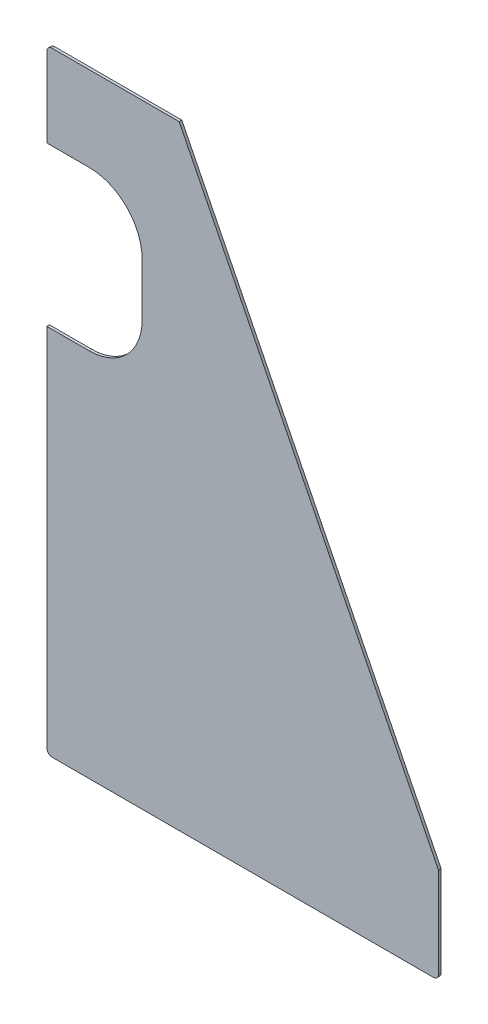
ISO-10303-21;
HEADER;
FILE_DESCRIPTION(('STEP AP214'),'2;1');
FILE_NAME('part.step','',(''),(''),'','','');
FILE_SCHEMA(('AUTOMOTIVE_DESIGN { 1 0 10303 214 1 1 1 1 }'));
ENDSEC;
DATA;
#1=APPLICATION_CONTEXT('core data for automotive mechanical design processes');
#2=APPLICATION_PROTOCOL_DEFINITION('international standard','automotive_design',2000,#1);
#3=PRODUCT_CONTEXT('',#1,'mechanical');
#4=PRODUCT('Part','Part','',(#3));
#5=PRODUCT_RELATED_PRODUCT_CATEGORY('part','',(#4));
#6=PRODUCT_DEFINITION_FORMATION('','',#4);
#7=PRODUCT_DEFINITION_CONTEXT('part definition',#1,'design');
#8=PRODUCT_DEFINITION('design','',#6,#7);
#9=PRODUCT_DEFINITION_SHAPE('','',#8);
#10=(LENGTH_UNIT() NAMED_UNIT(*) SI_UNIT(.MILLI.,.METRE.));
#11=(NAMED_UNIT(*) PLANE_ANGLE_UNIT() SI_UNIT($,.RADIAN.));
#12=(NAMED_UNIT(*) SI_UNIT($,.STERADIAN.) SOLID_ANGLE_UNIT());
#13=UNCERTAINTY_MEASURE_WITH_UNIT(LENGTH_MEASURE(1.E-05),#10,'distance_accuracy_value','');
#14=(GEOMETRIC_REPRESENTATION_CONTEXT(3) GLOBAL_UNCERTAINTY_ASSIGNED_CONTEXT((#13)) GLOBAL_UNIT_ASSIGNED_CONTEXT((#10,
#11,#12)) REPRESENTATION_CONTEXT('',''));
#15=CARTESIAN_POINT('',(0.,0.,0.));
#16=DIRECTION('',(0.,0.,1.));
#17=DIRECTION('',(1.,0.,0.));
#18=AXIS2_PLACEMENT_3D('',#15,#16,#17);
#19=CARTESIAN_POINT('',(-370.,-580.,5.));
#20=DIRECTION('',(1.,0.,0.));
#21=DIRECTION('',(0.,0.,-1.));
#22=AXIS2_PLACEMENT_3D('',#19,#20,#21);
#23=PLANE('',#22);
#24=DIRECTION('',(0.,-1.,0.));
#25=VECTOR('',#24,1.);
#26=CARTESIAN_POINT('',(-370.,-580.,5.));
#27=LINE('',#26,#25);
#28=CARTESIAN_POINT('',(-370.,120.,5.));
#29=VERTEX_POINT('',#28);
#30=CARTESIAN_POINT('',(-370.,-570.,5.));
#31=VERTEX_POINT('',#30);
#32=EDGE_CURVE('E160',#29,#31,#27,.T.);
#33=ORIENTED_EDGE('',*,*,#32,.F.);
#34=DIRECTION('',(0.,0.,-1.));
#35=VECTOR('',#34,1.);
#36=CARTESIAN_POINT('',(-370.,120.,5.));
#37=LINE('',#36,#35);
#38=CARTESIAN_POINT('',(-370.,120.,0.));
#39=VERTEX_POINT('',#38);
#40=EDGE_CURVE('E152',#29,#39,#37,.T.);
#41=ORIENTED_EDGE('',*,*,#40,.T.);
#42=DIRECTION('',(0.,-1.,0.));
#43=VECTOR('',#42,1.);
#44=CARTESIAN_POINT('',(-370.,-580.,0.));
#45=LINE('',#44,#43);
#46=CARTESIAN_POINT('',(-370.,-570.,0.));
#47=VERTEX_POINT('',#46);
#48=EDGE_CURVE('E175',#39,#47,#45,.T.);
#49=ORIENTED_EDGE('',*,*,#48,.T.);
#50=DIRECTION('',(0.,0.,-1.));
#51=VECTOR('',#50,1.);
#52=CARTESIAN_POINT('',(-370.,-570.,5.));
#53=LINE('',#52,#51);
#54=EDGE_CURVE('E195',#47,#31,#53,.F.);
#55=ORIENTED_EDGE('',*,*,#54,.T.);
#56=EDGE_LOOP('',(#33,#41,#49,#55));
#57=FACE_BOUND('',#56,.T.);
#58=ADVANCED_FACE('F33',(#57),#23,.F.);
#59=CARTESIAN_POINT('',(370.,-580.,5.));
#60=DIRECTION('',(-1.,0.,0.));
#61=DIRECTION('',(0.,0.,1.));
#62=AXIS2_PLACEMENT_3D('',#59,#60,#61);
#63=PLANE('',#62);
#64=DIRECTION('',(0.,1.,0.));
#65=VECTOR('',#64,1.);
#66=CARTESIAN_POINT('',(370.,-580.,0.));
#67=LINE('',#66,#65);
#68=CARTESIAN_POINT('',(370.,-570.,0.));
#69=VERTEX_POINT('',#68);
#70=CARTESIAN_POINT('',(370.,-400.,0.));
#71=VERTEX_POINT('',#70);
#72=EDGE_CURVE('E169',#69,#71,#67,.T.);
#73=ORIENTED_EDGE('',*,*,#72,.T.);
#74=DIRECTION('',(0.,0.,-1.));
#75=VECTOR('',#74,1.);
#76=CARTESIAN_POINT('',(370.,-400.,5.));
#77=LINE('',#76,#75);
#78=CARTESIAN_POINT('',(370.,-400.,5.));
#79=VERTEX_POINT('',#78);
#80=EDGE_CURVE('E293',#79,#71,#77,.T.);
#81=ORIENTED_EDGE('',*,*,#80,.F.);
#82=DIRECTION('',(0.,1.,0.));
#83=VECTOR('',#82,1.);
#84=CARTESIAN_POINT('',(370.,-580.,5.));
#85=LINE('',#84,#83);
#86=CARTESIAN_POINT('',(370.,-570.,5.));
#87=VERTEX_POINT('',#86);
#88=EDGE_CURVE('E180',#87,#79,#85,.T.);
#89=ORIENTED_EDGE('',*,*,#88,.F.);
#90=DIRECTION('',(0.,0.,-1.));
#91=VECTOR('',#90,1.);
#92=CARTESIAN_POINT('',(370.,-570.,5.));
#93=LINE('',#92,#91);
#94=EDGE_CURVE('E203',#87,#69,#93,.T.);
#95=ORIENTED_EDGE('',*,*,#94,.T.);
#96=EDGE_LOOP('',(#73,#81,#89,#95));
#97=FACE_BOUND('',#96,.T.);
#98=ADVANCED_FACE('F235',(#97),#63,.F.);
#99=CARTESIAN_POINT('',(-370.,580.,5.));
#100=DIRECTION('',(0.,-1.,0.));
#101=DIRECTION('',(0.,0.,-1.));
#102=AXIS2_PLACEMENT_3D('',#99,#100,#101);
#103=PLANE('',#102);
#104=DIRECTION('',(-1.,0.,0.));
#105=VECTOR('',#104,1.);
#106=CARTESIAN_POINT('',(-370.,580.,5.));
#107=LINE('',#106,#105);
#108=CARTESIAN_POINT('',(-120.,580.,5.));
#109=VERTEX_POINT('',#108);
#110=CARTESIAN_POINT('',(-360.,580.,5.));
#111=VERTEX_POINT('',#110);
#112=EDGE_CURVE('E165',#109,#111,#107,.T.);
#113=ORIENTED_EDGE('',*,*,#112,.F.);
#114=DIRECTION('',(0.,0.,-1.));
#115=VECTOR('',#114,1.);
#116=CARTESIAN_POINT('',(-120.,580.,5.));
#117=LINE('',#116,#115);
#118=CARTESIAN_POINT('',(-120.,580.,0.));
#119=VERTEX_POINT('',#118);
#120=EDGE_CURVE('E173',#109,#119,#117,.T.);
#121=ORIENTED_EDGE('',*,*,#120,.T.);
#122=DIRECTION('',(-1.,0.,0.));
#123=VECTOR('',#122,1.);
#124=CARTESIAN_POINT('',(-370.,580.,0.));
#125=LINE('',#124,#123);
#126=CARTESIAN_POINT('',(-360.,580.,0.));
#127=VERTEX_POINT('',#126);
#128=EDGE_CURVE('E172',#119,#127,#125,.T.);
#129=ORIENTED_EDGE('',*,*,#128,.T.);
#130=DIRECTION('',(0.,0.,-1.));
#131=VECTOR('',#130,1.);
#132=CARTESIAN_POINT('',(-360.,580.,5.));
#133=LINE('',#132,#131);
#134=EDGE_CURVE('E206',#127,#111,#133,.F.);
#135=ORIENTED_EDGE('',*,*,#134,.T.);
#136=EDGE_LOOP('',(#113,#121,#129,#135));
#137=FACE_BOUND('',#136,.T.);
#138=ADVANCED_FACE('F241',(#137),#103,.F.);
#139=CARTESIAN_POINT('',(-370.,570.,0.));
#140=VERTEX_POINT('',#139);
#141=CARTESIAN_POINT('',(-370.,420.,0.));
#142=VERTEX_POINT('',#141);
#143=EDGE_CURVE('E151',#140,#142,#45,.T.);
#144=ORIENTED_EDGE('',*,*,#143,.T.);
#145=DIRECTION('',(0.,0.,1.));
#146=VECTOR('',#145,1.);
#147=CARTESIAN_POINT('',(-370.,420.,5.));
#148=LINE('',#147,#146);
#149=CARTESIAN_POINT('',(-370.,420.,5.));
#150=VERTEX_POINT('',#149);
#151=EDGE_CURVE('E136',#142,#150,#148,.T.);
#152=ORIENTED_EDGE('',*,*,#151,.T.);
#153=CARTESIAN_POINT('',(-370.,570.,5.));
#154=VERTEX_POINT('',#153);
#155=EDGE_CURVE('E148',#154,#150,#27,.T.);
#156=ORIENTED_EDGE('',*,*,#155,.F.);
#157=DIRECTION('',(0.,0.,-1.));
#158=VECTOR('',#157,1.);
#159=CARTESIAN_POINT('',(-370.,570.,5.));
#160=LINE('',#159,#158);
#161=EDGE_CURVE('E193',#154,#140,#160,.T.);
#162=ORIENTED_EDGE('',*,*,#161,.T.);
#163=EDGE_LOOP('',(#144,#152,#156,#162));
#164=FACE_BOUND('',#163,.T.);
#165=ADVANCED_FACE('F146',(#164),#23,.F.);
#166=CARTESIAN_POINT('',(-370.,-580.,5.));
#167=DIRECTION('',(0.,1.,0.));
#168=DIRECTION('',(0.,0.,1.));
#169=AXIS2_PLACEMENT_3D('',#166,#167,#168);
#170=PLANE('',#169);
#171=DIRECTION('',(1.,0.,0.));
#172=VECTOR('',#171,1.);
#173=CARTESIAN_POINT('',(-370.,-580.,5.));
#174=LINE('',#173,#172);
#175=CARTESIAN_POINT('',(-360.,-580.,5.));
#176=VERTEX_POINT('',#175);
#177=CARTESIAN_POINT('',(360.,-580.,5.));
#178=VERTEX_POINT('',#177);
#179=EDGE_CURVE('E159',#176,#178,#174,.T.);
#180=ORIENTED_EDGE('',*,*,#179,.F.);
#181=DIRECTION('',(0.,0.,-1.));
#182=VECTOR('',#181,1.);
#183=CARTESIAN_POINT('',(-360.,-580.,5.));
#184=LINE('',#183,#182);
#185=CARTESIAN_POINT('',(-360.,-580.,0.));
#186=VERTEX_POINT('',#185);
#187=EDGE_CURVE('E182',#176,#186,#184,.T.);
#188=ORIENTED_EDGE('',*,*,#187,.T.);
#189=DIRECTION('',(1.,0.,0.));
#190=VECTOR('',#189,1.);
#191=CARTESIAN_POINT('',(-370.,-580.,0.));
#192=LINE('',#191,#190);
#193=CARTESIAN_POINT('',(360.,-580.,0.));
#194=VERTEX_POINT('',#193);
#195=EDGE_CURVE('E177',#186,#194,#192,.T.);
#196=ORIENTED_EDGE('',*,*,#195,.T.);
#197=DIRECTION('',(0.,0.,-1.));
#198=VECTOR('',#197,1.);
#199=CARTESIAN_POINT('',(360.,-580.,5.));
#200=LINE('',#199,#198);
#201=EDGE_CURVE('E163',#194,#178,#200,.F.);
#202=ORIENTED_EDGE('',*,*,#201,.T.);
#203=EDGE_LOOP('',(#180,#188,#196,#202));
#204=FACE_BOUND('',#203,.T.);
#205=ADVANCED_FACE('F248',(#204),#170,.F.);
#206=CARTESIAN_POINT('',(0.,0.,5.));
#207=DIRECTION('',(0.,0.,-1.));
#208=DIRECTION('',(-1.,0.,0.));
#209=AXIS2_PLACEMENT_3D('',#206,#207,#208);
#210=PLANE('',#209);
#211=DIRECTION('',(0.,1.,0.));
#212=VECTOR('',#211,1.);
#213=CARTESIAN_POINT('',(-190.,120.,5.));
#214=LINE('',#213,#212);
#215=CARTESIAN_POINT('',(-190.,220.,5.));
#216=VERTEX_POINT('',#215);
#217=CARTESIAN_POINT('',(-190.,320.,5.));
#218=VERTEX_POINT('',#217);
#219=EDGE_CURVE('E142',#216,#218,#214,.T.);
#220=ORIENTED_EDGE('',*,*,#219,.F.);
#221=CARTESIAN_POINT('',(-290.,220.,5.));
#222=DIRECTION('',(0.,0.,-1.));
#223=DIRECTION('',(-1.,0.,0.));
#224=AXIS2_PLACEMENT_3D('',#221,#222,#223);
#225=CIRCLE('',#224,100.);
#226=CARTESIAN_POINT('',(-290.,120.,5.));
#227=VERTEX_POINT('',#226);
#228=EDGE_CURVE('E219',#216,#227,#225,.T.);
#229=ORIENTED_EDGE('',*,*,#228,.T.);
#230=DIRECTION('',(1.,0.,0.));
#231=VECTOR('',#230,1.);
#232=CARTESIAN_POINT('',(-550.,120.,5.));
#233=LINE('',#232,#231);
#234=EDGE_CURVE('E141',#29,#227,#233,.T.);
#235=ORIENTED_EDGE('',*,*,#234,.F.);
#236=ORIENTED_EDGE('',*,*,#32,.T.);
#237=CARTESIAN_POINT('',(-360.,-570.,5.));
#238=DIRECTION('',(0.,0.,-1.));
#239=DIRECTION('',(-1.,0.,0.));
#240=AXIS2_PLACEMENT_3D('',#237,#238,#239);
#241=CIRCLE('',#240,10.);
#242=EDGE_CURVE('E201',#31,#176,#241,.F.);
#243=ORIENTED_EDGE('',*,*,#242,.T.);
#244=ORIENTED_EDGE('',*,*,#179,.T.);
#245=CARTESIAN_POINT('',(360.,-570.,5.));
#246=DIRECTION('',(0.,0.,-1.));
#247=DIRECTION('',(-1.,0.,0.));
#248=AXIS2_PLACEMENT_3D('',#245,#246,#247);
#249=CIRCLE('',#248,10.);
#250=EDGE_CURVE('E199',#178,#87,#249,.F.);
#251=ORIENTED_EDGE('',*,*,#250,.T.);
#252=ORIENTED_EDGE('',*,*,#88,.T.);
#253=DIRECTION('',(-0.447213595499958,0.894427190999916,0.));
#254=VECTOR('',#253,1.);
#255=CARTESIAN_POINT('',(370.,-400.,5.));
#256=LINE('',#255,#254);
#257=EDGE_CURVE('E290',#79,#109,#256,.T.);
#258=ORIENTED_EDGE('',*,*,#257,.T.);
#259=ORIENTED_EDGE('',*,*,#112,.T.);
#260=CARTESIAN_POINT('',(-360.,570.,5.));
#261=DIRECTION('',(0.,0.,-1.));
#262=DIRECTION('',(-1.,0.,0.));
#263=AXIS2_PLACEMENT_3D('',#260,#261,#262);
#264=CIRCLE('',#263,10.);
#265=EDGE_CURVE('E158',#111,#154,#264,.F.);
#266=ORIENTED_EDGE('',*,*,#265,.T.);
#267=ORIENTED_EDGE('',*,*,#155,.T.);
#268=DIRECTION('',(-1.,0.,0.));
#269=VECTOR('',#268,1.);
#270=CARTESIAN_POINT('',(-550.,420.,5.));
#271=LINE('',#270,#269);
#272=CARTESIAN_POINT('',(-290.,420.,5.));
#273=VERTEX_POINT('',#272);
#274=EDGE_CURVE('E133',#273,#150,#271,.T.);
#275=ORIENTED_EDGE('',*,*,#274,.F.);
#276=CARTESIAN_POINT('',(-290.,320.,5.));
#277=DIRECTION('',(0.,0.,-1.));
#278=DIRECTION('',(-1.,0.,0.));
#279=AXIS2_PLACEMENT_3D('',#276,#277,#278);
#280=CIRCLE('',#279,100.);
#281=EDGE_CURVE('E41',#273,#218,#280,.T.);
#282=ORIENTED_EDGE('',*,*,#281,.T.);
#283=EDGE_LOOP('',(#220,#229,#235,#236,#243,#244,#251,#252,#258,#259,#266,#267,#275,#282));
#284=FACE_BOUND('',#283,.T.);
#285=ADVANCED_FACE('F156',(#284),#210,.F.);
#286=CARTESIAN_POINT('',(0.,0.,0.));
#287=DIRECTION('',(0.,0.,-1.));
#288=DIRECTION('',(-1.,0.,0.));
#289=AXIS2_PLACEMENT_3D('',#286,#287,#288);
#290=PLANE('',#289);
#291=DIRECTION('',(-1.,0.,0.));
#292=VECTOR('',#291,1.);
#293=CARTESIAN_POINT('',(0.,120.,0.));
#294=LINE('',#293,#292);
#295=CARTESIAN_POINT('',(-290.,120.,0.));
#296=VERTEX_POINT('',#295);
#297=EDGE_CURVE('E209',#296,#39,#294,.T.);
#298=ORIENTED_EDGE('',*,*,#297,.F.);
#299=CARTESIAN_POINT('',(-290.,220.,0.));
#300=DIRECTION('',(0.,0.,-1.));
#301=DIRECTION('',(-1.,0.,0.));
#302=AXIS2_PLACEMENT_3D('',#299,#300,#301);
#303=CIRCLE('',#302,100.);
#304=CARTESIAN_POINT('',(-190.,220.,0.));
#305=VERTEX_POINT('',#304);
#306=EDGE_CURVE('E221',#296,#305,#303,.F.);
#307=ORIENTED_EDGE('',*,*,#306,.T.);
#308=DIRECTION('',(0.,1.,0.));
#309=VECTOR('',#308,1.);
#310=CARTESIAN_POINT('',(-190.,120.,0.));
#311=LINE('',#310,#309);
#312=CARTESIAN_POINT('',(-190.,320.,0.));
#313=VERTEX_POINT('',#312);
#314=EDGE_CURVE('E281',#305,#313,#311,.T.);
#315=ORIENTED_EDGE('',*,*,#314,.T.);
#316=CARTESIAN_POINT('',(-290.,320.,0.));
#317=DIRECTION('',(0.,0.,-1.));
#318=DIRECTION('',(-1.,0.,0.));
#319=AXIS2_PLACEMENT_3D('',#316,#317,#318);
#320=CIRCLE('',#319,100.);
#321=CARTESIAN_POINT('',(-290.,420.,0.));
#322=VERTEX_POINT('',#321);
#323=EDGE_CURVE('E11',#313,#322,#320,.F.);
#324=ORIENTED_EDGE('',*,*,#323,.T.);
#325=DIRECTION('',(-1.,0.,0.));
#326=VECTOR('',#325,1.);
#327=CARTESIAN_POINT('',(-550.,420.,0.));
#328=LINE('',#327,#326);
#329=EDGE_CURVE('E153',#322,#142,#328,.T.);
#330=ORIENTED_EDGE('',*,*,#329,.T.);
#331=ORIENTED_EDGE('',*,*,#143,.F.);
#332=CARTESIAN_POINT('',(-360.,570.,0.));
#333=DIRECTION('',(0.,0.,-1.));
#334=DIRECTION('',(-1.,0.,0.));
#335=AXIS2_PLACEMENT_3D('',#332,#333,#334);
#336=CIRCLE('',#335,10.);
#337=EDGE_CURVE('E185',#140,#127,#336,.T.);
#338=ORIENTED_EDGE('',*,*,#337,.T.);
#339=ORIENTED_EDGE('',*,*,#128,.F.);
#340=DIRECTION('',(-0.447213595499958,0.894427190999916,0.));
#341=VECTOR('',#340,1.);
#342=CARTESIAN_POINT('',(370.,-400.,0.));
#343=LINE('',#342,#341);
#344=EDGE_CURVE('E289',#71,#119,#343,.T.);
#345=ORIENTED_EDGE('',*,*,#344,.F.);
#346=ORIENTED_EDGE('',*,*,#72,.F.);
#347=CARTESIAN_POINT('',(360.,-570.,0.));
#348=DIRECTION('',(0.,0.,-1.));
#349=DIRECTION('',(-1.,0.,0.));
#350=AXIS2_PLACEMENT_3D('',#347,#348,#349);
#351=CIRCLE('',#350,10.);
#352=EDGE_CURVE('E188',#69,#194,#351,.T.);
#353=ORIENTED_EDGE('',*,*,#352,.T.);
#354=ORIENTED_EDGE('',*,*,#195,.F.);
#355=CARTESIAN_POINT('',(-360.,-570.,0.));
#356=DIRECTION('',(0.,0.,-1.));
#357=DIRECTION('',(-1.,0.,0.));
#358=AXIS2_PLACEMENT_3D('',#355,#356,#357);
#359=CIRCLE('',#358,10.);
#360=EDGE_CURVE('E190',#186,#47,#359,.T.);
#361=ORIENTED_EDGE('',*,*,#360,.T.);
#362=ORIENTED_EDGE('',*,*,#48,.F.);
#363=EDGE_LOOP('',(#298,#307,#315,#324,#330,#331,#338,#339,#345,#346,#353,#354,#361,#362));
#364=FACE_BOUND('',#363,.T.);
#365=ADVANCED_FACE('F263',(#364),#290,.T.);
#366=CARTESIAN_POINT('',(-360.,-570.,5.));
#367=DIRECTION('',(0.,0.,-1.));
#368=DIRECTION('',(-1.,0.,0.));
#369=AXIS2_PLACEMENT_3D('',#366,#367,#368);
#370=CYLINDRICAL_SURFACE('',#369,10.);
#371=ORIENTED_EDGE('',*,*,#242,.F.);
#372=ORIENTED_EDGE('',*,*,#54,.F.);
#373=ORIENTED_EDGE('',*,*,#360,.F.);
#374=ORIENTED_EDGE('',*,*,#187,.F.);
#375=EDGE_LOOP('',(#371,#372,#373,#374));
#376=FACE_BOUND('',#375,.T.);
#377=ADVANCED_FACE('F259',(#376),#370,.T.);
#378=CARTESIAN_POINT('',(360.,-570.,5.));
#379=DIRECTION('',(0.,0.,-1.));
#380=DIRECTION('',(-1.,0.,0.));
#381=AXIS2_PLACEMENT_3D('',#378,#379,#380);
#382=CYLINDRICAL_SURFACE('',#381,10.);
#383=ORIENTED_EDGE('',*,*,#250,.F.);
#384=ORIENTED_EDGE('',*,*,#201,.F.);
#385=ORIENTED_EDGE('',*,*,#352,.F.);
#386=ORIENTED_EDGE('',*,*,#94,.F.);
#387=EDGE_LOOP('',(#383,#384,#385,#386));
#388=FACE_BOUND('',#387,.T.);
#389=ADVANCED_FACE('F262',(#388),#382,.T.);
#390=CARTESIAN_POINT('',(-360.,570.,5.));
#391=DIRECTION('',(0.,0.,-1.));
#392=DIRECTION('',(-1.,0.,0.));
#393=AXIS2_PLACEMENT_3D('',#390,#391,#392);
#394=CYLINDRICAL_SURFACE('',#393,10.);
#395=ORIENTED_EDGE('',*,*,#265,.F.);
#396=ORIENTED_EDGE('',*,*,#134,.F.);
#397=ORIENTED_EDGE('',*,*,#337,.F.);
#398=ORIENTED_EDGE('',*,*,#161,.F.);
#399=EDGE_LOOP('',(#395,#396,#397,#398));
#400=FACE_BOUND('',#399,.T.);
#401=ADVANCED_FACE('F267',(#400),#394,.T.);
#402=CARTESIAN_POINT('',(370.,-400.,5.));
#403=DIRECTION('',(-0.894427190999916,-0.447213595499958,0.));
#404=DIRECTION('',(0.447213595499958,-0.894427190999916,0.));
#405=AXIS2_PLACEMENT_3D('',#402,#403,#404);
#406=PLANE('',#405);
#407=ORIENTED_EDGE('',*,*,#344,.T.);
#408=ORIENTED_EDGE('',*,*,#120,.F.);
#409=ORIENTED_EDGE('',*,*,#257,.F.);
#410=ORIENTED_EDGE('',*,*,#80,.T.);
#411=EDGE_LOOP('',(#407,#408,#409,#410));
#412=FACE_BOUND('',#411,.T.);
#413=ADVANCED_FACE('F270',(#412),#406,.F.);
#414=CARTESIAN_POINT('',(-550.,120.,0.));
#415=DIRECTION('',(0.,-1.,0.));
#416=DIRECTION('',(0.,0.,-1.));
#417=AXIS2_PLACEMENT_3D('',#414,#415,#416);
#418=PLANE('',#417);
#419=ORIENTED_EDGE('',*,*,#234,.T.);
#420=DIRECTION('',(0.,0.,1.));
#421=VECTOR('',#420,1.);
#422=CARTESIAN_POINT('',(-290.,120.,0.));
#423=LINE('',#422,#421);
#424=EDGE_CURVE('E216',#227,#296,#423,.F.);
#425=ORIENTED_EDGE('',*,*,#424,.T.);
#426=ORIENTED_EDGE('',*,*,#297,.T.);
#427=ORIENTED_EDGE('',*,*,#40,.F.);
#428=EDGE_LOOP('',(#419,#425,#426,#427));
#429=FACE_BOUND('',#428,.T.);
#430=ADVANCED_FACE('F275',(#429),#418,.F.);
#431=CARTESIAN_POINT('',(-550.,420.,0.));
#432=DIRECTION('',(0.,1.,0.));
#433=DIRECTION('',(0.,0.,1.));
#434=AXIS2_PLACEMENT_3D('',#431,#432,#433);
#435=PLANE('',#434);
#436=ORIENTED_EDGE('',*,*,#329,.F.);
#437=DIRECTION('',(0.,0.,1.));
#438=VECTOR('',#437,1.);
#439=CARTESIAN_POINT('',(-290.,420.,5.));
#440=LINE('',#439,#438);
#441=EDGE_CURVE('E138',#322,#273,#440,.T.);
#442=ORIENTED_EDGE('',*,*,#441,.T.);
#443=ORIENTED_EDGE('',*,*,#274,.T.);
#444=ORIENTED_EDGE('',*,*,#151,.F.);
#445=EDGE_LOOP('',(#436,#442,#443,#444));
#446=FACE_BOUND('',#445,.T.);
#447=ADVANCED_FACE('F135',(#446),#435,.F.);
#448=CARTESIAN_POINT('',(-190.,120.,0.));
#449=DIRECTION('',(1.,0.,0.));
#450=DIRECTION('',(0.,0.,-1.));
#451=AXIS2_PLACEMENT_3D('',#448,#449,#450);
#452=PLANE('',#451);
#453=ORIENTED_EDGE('',*,*,#314,.F.);
#454=DIRECTION('',(0.,0.,1.));
#455=VECTOR('',#454,1.);
#456=CARTESIAN_POINT('',(-190.,220.,5.));
#457=LINE('',#456,#455);
#458=EDGE_CURVE('E213',#305,#216,#457,.T.);
#459=ORIENTED_EDGE('',*,*,#458,.T.);
#460=ORIENTED_EDGE('',*,*,#219,.T.);
#461=DIRECTION('',(0.,0.,1.));
#462=VECTOR('',#461,1.);
#463=CARTESIAN_POINT('',(-190.,320.,0.));
#464=LINE('',#463,#462);
#465=EDGE_CURVE('E211',#218,#313,#464,.F.);
#466=ORIENTED_EDGE('',*,*,#465,.T.);
#467=EDGE_LOOP('',(#453,#459,#460,#466));
#468=FACE_BOUND('',#467,.T.);
#469=ADVANCED_FACE('F225',(#468),#452,.F.);
#470=CARTESIAN_POINT('',(-290.,220.,0.));
#471=DIRECTION('',(0.,0.,-1.));
#472=DIRECTION('',(-1.,0.,0.));
#473=AXIS2_PLACEMENT_3D('',#470,#471,#472);
#474=CYLINDRICAL_SURFACE('',#473,100.);
#475=ORIENTED_EDGE('',*,*,#306,.F.);
#476=ORIENTED_EDGE('',*,*,#424,.F.);
#477=ORIENTED_EDGE('',*,*,#228,.F.);
#478=ORIENTED_EDGE('',*,*,#458,.F.);
#479=EDGE_LOOP('',(#475,#476,#477,#478));
#480=FACE_BOUND('',#479,.T.);
#481=ADVANCED_FACE('F229',(#480),#474,.F.);
#482=CARTESIAN_POINT('',(-290.,320.,0.));
#483=DIRECTION('',(0.,0.,-1.));
#484=DIRECTION('',(-1.,0.,0.));
#485=AXIS2_PLACEMENT_3D('',#482,#483,#484);
#486=CYLINDRICAL_SURFACE('',#485,100.);
#487=ORIENTED_EDGE('',*,*,#323,.F.);
#488=ORIENTED_EDGE('',*,*,#465,.F.);
#489=ORIENTED_EDGE('',*,*,#281,.F.);
#490=ORIENTED_EDGE('',*,*,#441,.F.);
#491=EDGE_LOOP('',(#487,#488,#489,#490));
#492=FACE_BOUND('',#491,.T.);
#493=ADVANCED_FACE('F35',(#492),#486,.F.);
#494=CLOSED_SHELL('',(#58,#98,#138,#165,#205,#285,#365,#377,#389,#401,#413,#430,#447,#469,#481,#493));
#495=MANIFOLD_SOLID_BREP('B2',#494);
#496=ADVANCED_BREP_SHAPE_REPRESENTATION('',(#18,#495),#14);
#497=SHAPE_DEFINITION_REPRESENTATION(#9,#496);
ENDSEC;
END-ISO-10303-21;
